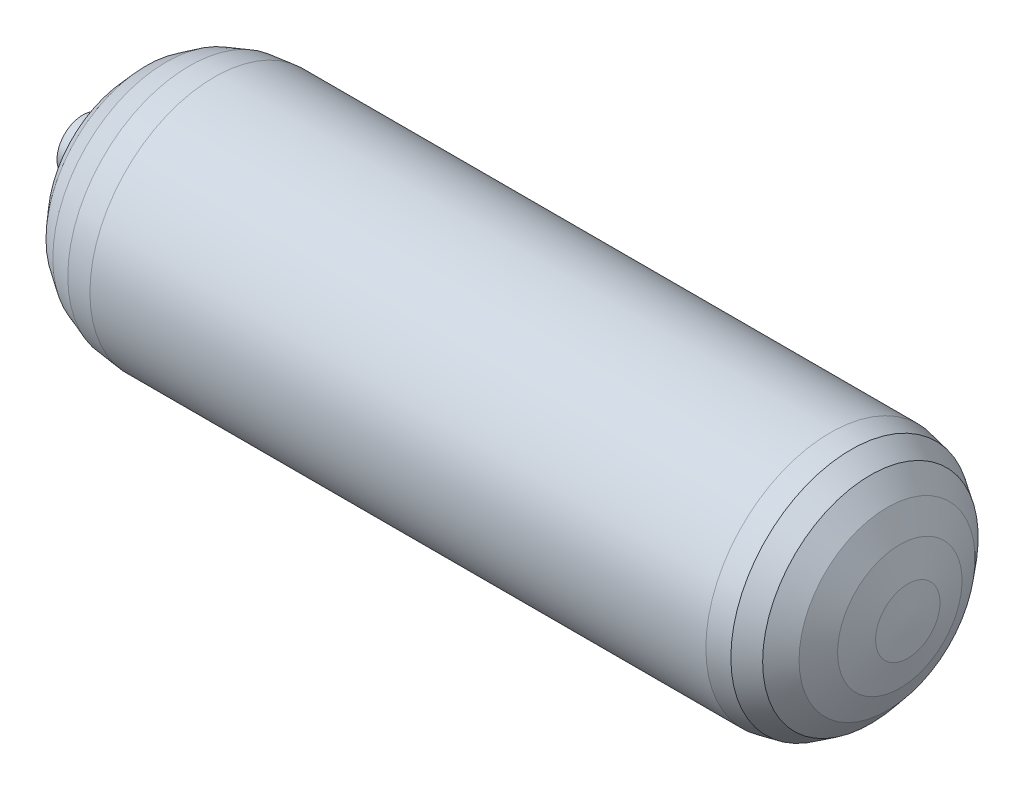
ISO-10303-21;
HEADER;
FILE_DESCRIPTION(('STEP AP214'),'2;1');
FILE_NAME('part.step','',(''),(''),'','','');
FILE_SCHEMA(('AUTOMOTIVE_DESIGN { 1 0 10303 214 1 1 1 1 }'));
ENDSEC;
DATA;
#1=APPLICATION_CONTEXT('core data for automotive mechanical design processes');
#2=APPLICATION_PROTOCOL_DEFINITION('international standard','automotive_design',2000,#1);
#3=PRODUCT_CONTEXT('',#1,'mechanical');
#4=PRODUCT('Part','Part','',(#3));
#5=PRODUCT_RELATED_PRODUCT_CATEGORY('part','',(#4));
#6=PRODUCT_DEFINITION_FORMATION('','',#4);
#7=PRODUCT_DEFINITION_CONTEXT('part definition',#1,'design');
#8=PRODUCT_DEFINITION('design','',#6,#7);
#9=PRODUCT_DEFINITION_SHAPE('','',#8);
#10=(LENGTH_UNIT() NAMED_UNIT(*) SI_UNIT(.MILLI.,.METRE.));
#11=(NAMED_UNIT(*) PLANE_ANGLE_UNIT() SI_UNIT($,.RADIAN.));
#12=(NAMED_UNIT(*) SI_UNIT($,.STERADIAN.) SOLID_ANGLE_UNIT());
#13=UNCERTAINTY_MEASURE_WITH_UNIT(LENGTH_MEASURE(1.E-05),#10,'distance_accuracy_value','');
#14=(GEOMETRIC_REPRESENTATION_CONTEXT(3) GLOBAL_UNCERTAINTY_ASSIGNED_CONTEXT((#13)) GLOBAL_UNIT_ASSIGNED_CONTEXT((#10,
#11,#12)) REPRESENTATION_CONTEXT('',''));
#15=CARTESIAN_POINT('',(0.,0.,0.));
#16=DIRECTION('',(0.,0.,1.));
#17=DIRECTION('',(1.,0.,0.));
#18=AXIS2_PLACEMENT_3D('',#15,#16,#17);
#19=CARTESIAN_POINT('',(0.,0.,0.));
#20=DIRECTION('',(1.,0.,0.));
#21=DIRECTION('',(0.,0.,-1.));
#22=AXIS2_PLACEMENT_3D('',#19,#20,#21);
#23=PLANE('',#22);
#24=CARTESIAN_POINT('',(0.,0.,0.));
#25=DIRECTION('',(1.,0.,0.));
#26=DIRECTION('',(0.,0.,-1.));
#27=AXIS2_PLACEMENT_3D('',#24,#25,#26);
#28=CIRCLE('',#27,10.1125);
#29=CARTESIAN_POINT('',(0.,0.,-10.1125));
#30=VERTEX_POINT('',#29);
#31=EDGE_CURVE('E42',#30,#30,#28,.F.);
#32=ORIENTED_EDGE('',*,*,#31,.F.);
#33=EDGE_LOOP('',(#32));
#34=FACE_BOUND('',#33,.T.);
#35=CARTESIAN_POINT('',(0.,0.,0.));
#36=DIRECTION('',(-1.,0.,0.));
#37=DIRECTION('',(0.,0.,1.));
#38=AXIS2_PLACEMENT_3D('',#35,#36,#37);
#39=CIRCLE('',#38,16.);
#40=CARTESIAN_POINT('',(0.,0.,16.));
#41=VERTEX_POINT('',#40);
#42=EDGE_CURVE('E11',#41,#41,#39,.T.);
#43=ORIENTED_EDGE('',*,*,#42,.T.);
#44=EDGE_LOOP('',(#43));
#45=FACE_BOUND('',#44,.T.);
#46=ADVANCED_FACE('F41',(#34,#45),#23,.F.);
#47=CARTESIAN_POINT('',(-1000.,0.,0.));
#48=DIRECTION('',(-1.,0.,0.));
#49=DIRECTION('',(0.,0.,1.));
#50=AXIS2_PLACEMENT_3D('',#47,#48,#49);
#51=CYLINDRICAL_SURFACE('',#50,16.);
#52=ORIENTED_EDGE('',*,*,#42,.F.);
#53=EDGE_LOOP('',(#52));
#54=FACE_BOUND('',#53,.T.);
#55=CARTESIAN_POINT('',(10.,0.,0.));
#56=DIRECTION('',(-1.,0.,0.));
#57=DIRECTION('',(0.,0.,1.));
#58=AXIS2_PLACEMENT_3D('',#55,#56,#57);
#59=CIRCLE('',#58,16.);
#60=CARTESIAN_POINT('',(10.,0.,16.));
#61=VERTEX_POINT('',#60);
#62=EDGE_CURVE('E48',#61,#61,#59,.T.);
#63=ORIENTED_EDGE('',*,*,#62,.T.);
#64=EDGE_LOOP('',(#63));
#65=FACE_BOUND('',#64,.T.);
#66=ADVANCED_FACE('F68',(#54,#65),#51,.T.);
#67=CARTESIAN_POINT('',(22.,0.,0.));
#68=DIRECTION('',(1.,0.,0.));
#69=DIRECTION('',(0.,0.,-1.));
#70=AXIS2_PLACEMENT_3D('',#67,#68,#69);
#71=CONICAL_SURFACE('',#70,26.,0.694738276196703);
#72=ORIENTED_EDGE('',*,*,#62,.F.);
#73=EDGE_LOOP('',(#72));
#74=FACE_BOUND('',#73,.T.);
#75=CARTESIAN_POINT('',(22.,0.,0.));
#76=DIRECTION('',(-1.,0.,0.));
#77=DIRECTION('',(0.,0.,1.));
#78=AXIS2_PLACEMENT_3D('',#75,#76,#77);
#79=CIRCLE('',#78,26.);
#80=CARTESIAN_POINT('',(22.,0.,26.));
#81=VERTEX_POINT('',#80);
#82=EDGE_CURVE('E83',#81,#81,#79,.T.);
#83=ORIENTED_EDGE('',*,*,#82,.T.);
#84=EDGE_LOOP('',(#83));
#85=FACE_BOUND('',#84,.T.);
#86=ADVANCED_FACE('F73',(#74,#85),#71,.T.);
#87=CARTESIAN_POINT('',(24.0444504226558,0.,0.));
#88=DIRECTION('',(1.,0.,0.));
#89=DIRECTION('',(0.,0.,-1.));
#90=AXIS2_PLACEMENT_3D('',#87,#88,#89);
#91=CONICAL_SURFACE('',#90,39.3291808227798,1.41860089104844);
#92=ORIENTED_EDGE('',*,*,#82,.F.);
#93=EDGE_LOOP('',(#92));
#94=FACE_BOUND('',#93,.T.);
#95=CARTESIAN_POINT('',(24.0444504226558,0.,0.));
#96=DIRECTION('',(-1.,0.,0.));
#97=DIRECTION('',(0.,0.,1.));
#98=AXIS2_PLACEMENT_3D('',#95,#96,#97);
#99=CIRCLE('',#98,39.3291808227798);
#100=CARTESIAN_POINT('',(24.0444504226558,0.,39.3291808227798));
#101=VERTEX_POINT('',#100);
#102=EDGE_CURVE('E86',#101,#101,#99,.T.);
#103=ORIENTED_EDGE('',*,*,#102,.T.);
#104=EDGE_LOOP('',(#103));
#105=FACE_BOUND('',#104,.T.);
#106=ADVANCED_FACE('F246',(#94,#105),#91,.T.);
#107=CARTESIAN_POINT('',(30.0384757729337,0.,0.));
#108=DIRECTION('',(1.,0.,0.));
#109=DIRECTION('',(0.,0.,-1.));
#110=AXIS2_PLACEMENT_3D('',#107,#108,#109);
#111=CONICAL_SURFACE('',#110,51.75,1.12118247006654);
#112=ORIENTED_EDGE('',*,*,#102,.F.);
#113=EDGE_LOOP('',(#112));
#114=FACE_BOUND('',#113,.T.);
#115=CARTESIAN_POINT('',(30.0384757729337,0.,0.));
#116=DIRECTION('',(-1.,0.,0.));
#117=DIRECTION('',(0.,0.,1.));
#118=AXIS2_PLACEMENT_3D('',#115,#116,#117);
#119=CIRCLE('',#118,51.75);
#120=CARTESIAN_POINT('',(30.0384757729337,0.,51.75));
#121=VERTEX_POINT('',#120);
#122=EDGE_CURVE('E91',#121,#121,#119,.T.);
#123=ORIENTED_EDGE('',*,*,#122,.T.);
#124=EDGE_LOOP('',(#123));
#125=FACE_BOUND('',#124,.T.);
#126=ADVANCED_FACE('F239',(#114,#125),#111,.T.);
#127=CARTESIAN_POINT('',(39.5735931288073,0.,0.));
#128=DIRECTION('',(1.,0.,0.));
#129=DIRECTION('',(0.,0.,-1.));
#130=AXIS2_PLACEMENT_3D('',#127,#128,#129);
#131=CONICAL_SURFACE('',#130,62.4159992311072,0.841320950320906);
#132=ORIENTED_EDGE('',*,*,#122,.F.);
#133=EDGE_LOOP('',(#132));
#134=FACE_BOUND('',#133,.T.);
#135=CARTESIAN_POINT('',(39.5735931288073,0.,0.));
#136=DIRECTION('',(-1.,0.,0.));
#137=DIRECTION('',(0.,0.,1.));
#138=AXIS2_PLACEMENT_3D('',#135,#136,#137);
#139=CIRCLE('',#138,62.4159992311072);
#140=CARTESIAN_POINT('',(39.5735931288073,0.,62.4159992311072));
#141=VERTEX_POINT('',#140);
#142=EDGE_CURVE('E96',#141,#141,#139,.T.);
#143=ORIENTED_EDGE('',*,*,#142,.T.);
#144=EDGE_LOOP('',(#143));
#145=FACE_BOUND('',#144,.T.);
#146=ADVANCED_FACE('F228',(#134,#145),#131,.T.);
#147=CARTESIAN_POINT('',(52.,0.,0.));
#148=DIRECTION('',(1.,0.,0.));
#149=DIRECTION('',(0.,0.,-1.));
#150=AXIS2_PLACEMENT_3D('',#147,#148,#149);
#151=CONICAL_SURFACE('',#150,70.6003082948986,0.582412752500819);
#152=ORIENTED_EDGE('',*,*,#142,.F.);
#153=EDGE_LOOP('',(#152));
#154=FACE_BOUND('',#153,.T.);
#155=CARTESIAN_POINT('',(52.,0.,0.));
#156=DIRECTION('',(-1.,0.,0.));
#157=DIRECTION('',(0.,0.,1.));
#158=AXIS2_PLACEMENT_3D('',#155,#156,#157);
#159=CIRCLE('',#158,70.6003082948986);
#160=CARTESIAN_POINT('',(52.,0.,70.6003082948986));
#161=VERTEX_POINT('',#160);
#162=EDGE_CURVE('E97',#161,#161,#159,.T.);
#163=ORIENTED_EDGE('',*,*,#162,.T.);
#164=EDGE_LOOP('',(#163));
#165=FACE_BOUND('',#164,.T.);
#166=ADVANCED_FACE('F218',(#154,#165),#151,.T.);
#167=CARTESIAN_POINT('',(66.4708572938488,0.,0.));
#168=DIRECTION('',(1.,0.,0.));
#169=DIRECTION('',(0.,0.,-1.));
#170=AXIS2_PLACEMENT_3D('',#167,#168,#169);
#171=CONICAL_SURFACE('',#170,75.745180053887,0.341595739566423);
#172=ORIENTED_EDGE('',*,*,#162,.F.);
#173=EDGE_LOOP('',(#172));
#174=FACE_BOUND('',#173,.T.);
#175=CARTESIAN_POINT('',(66.4708572938488,0.,0.));
#176=DIRECTION('',(-1.,0.,0.));
#177=DIRECTION('',(0.,0.,1.));
#178=AXIS2_PLACEMENT_3D('',#175,#176,#177);
#179=CIRCLE('',#178,75.745180053887);
#180=CARTESIAN_POINT('',(66.4708572938488,0.,75.745180053887));
#181=VERTEX_POINT('',#180);
#182=EDGE_CURVE('E105',#181,#181,#179,.T.);
#183=ORIENTED_EDGE('',*,*,#182,.T.);
#184=EDGE_LOOP('',(#183));
#185=FACE_BOUND('',#184,.T.);
#186=ADVANCED_FACE('F207',(#174,#185),#171,.T.);
#187=CARTESIAN_POINT('',(82.0000000000001,0.,0.));
#188=DIRECTION('',(1.,0.,0.));
#189=DIRECTION('',(0.,0.,-1.));
#190=AXIS2_PLACEMENT_3D('',#187,#188,#189);
#191=CONICAL_SURFACE('',#190,77.5,0.112524391245655);
#192=ORIENTED_EDGE('',*,*,#182,.F.);
#193=EDGE_LOOP('',(#192));
#194=FACE_BOUND('',#193,.T.);
#195=CARTESIAN_POINT('',(82.0000000000001,0.,0.));
#196=DIRECTION('',(-1.,0.,0.));
#197=DIRECTION('',(0.,0.,1.));
#198=AXIS2_PLACEMENT_3D('',#195,#196,#197);
#199=CIRCLE('',#198,77.5);
#200=CARTESIAN_POINT('',(82.0000000000001,0.,77.5));
#201=VERTEX_POINT('',#200);
#202=EDGE_CURVE('E104',#201,#201,#199,.T.);
#203=ORIENTED_EDGE('',*,*,#202,.T.);
#204=EDGE_LOOP('',(#203));
#205=FACE_BOUND('',#204,.T.);
#206=ADVANCED_FACE('F200',(#194,#205),#191,.T.);
#207=CARTESIAN_POINT('',(-1000.,0.,0.));
#208=DIRECTION('',(-1.,0.,0.));
#209=DIRECTION('',(0.,0.,1.));
#210=AXIS2_PLACEMENT_3D('',#207,#208,#209);
#211=CYLINDRICAL_SURFACE('',#210,77.5);
#212=ORIENTED_EDGE('',*,*,#202,.F.);
#213=EDGE_LOOP('',(#212));
#214=FACE_BOUND('',#213,.T.);
#215=CARTESIAN_POINT('',(465.6,0.,0.));
#216=DIRECTION('',(-1.,0.,0.));
#217=DIRECTION('',(0.,0.,1.));
#218=AXIS2_PLACEMENT_3D('',#215,#216,#217);
#219=CIRCLE('',#218,77.5);
#220=CARTESIAN_POINT('',(465.6,0.,77.5));
#221=VERTEX_POINT('',#220);
#222=EDGE_CURVE('E107',#221,#221,#219,.T.);
#223=ORIENTED_EDGE('',*,*,#222,.T.);
#224=EDGE_LOOP('',(#223));
#225=FACE_BOUND('',#224,.T.);
#226=ADVANCED_FACE('F188',(#214,#225),#211,.T.);
#227=CARTESIAN_POINT('',(478.540952255126,0.,0.));
#228=DIRECTION('',(-1.,0.,0.));
#229=DIRECTION('',(0.,0.,1.));
#230=AXIS2_PLACEMENT_3D('',#227,#228,#229);
#231=CONICAL_SURFACE('',#230,74.8592515374028,0.201297657036481);
#232=ORIENTED_EDGE('',*,*,#222,.F.);
#233=EDGE_LOOP('',(#232));
#234=FACE_BOUND('',#233,.T.);
#235=CARTESIAN_POINT('',(478.540952255126,0.,0.));
#236=DIRECTION('',(-1.,0.,0.));
#237=DIRECTION('',(0.,0.,1.));
#238=AXIS2_PLACEMENT_3D('',#235,#236,#237);
#239=CIRCLE('',#238,74.8592515374028);
#240=CARTESIAN_POINT('',(478.540952255126,0.,74.8592515374028));
#241=VERTEX_POINT('',#240);
#242=EDGE_CURVE('E112',#241,#241,#239,.T.);
#243=ORIENTED_EDGE('',*,*,#242,.T.);
#244=EDGE_LOOP('',(#243));
#245=FACE_BOUND('',#244,.T.);
#246=ADVANCED_FACE('F176',(#234,#245),#231,.T.);
#247=CARTESIAN_POINT('',(490.6,0.,0.));
#248=DIRECTION('',(-1.,0.,0.));
#249=DIRECTION('',(0.,0.,1.));
#250=AXIS2_PLACEMENT_3D('',#247,#248,#249);
#251=CONICAL_SURFACE('',#250,67.116968793294,0.570752712318134);
#252=ORIENTED_EDGE('',*,*,#242,.F.);
#253=EDGE_LOOP('',(#252));
#254=FACE_BOUND('',#253,.T.);
#255=CARTESIAN_POINT('',(490.6,0.,0.));
#256=DIRECTION('',(-1.,0.,0.));
#257=DIRECTION('',(0.,0.,1.));
#258=AXIS2_PLACEMENT_3D('',#255,#256,#257);
#259=CIRCLE('',#258,67.116968793294);
#260=CARTESIAN_POINT('',(490.6,0.,67.116968793294));
#261=VERTEX_POINT('',#260);
#262=EDGE_CURVE('E111',#261,#261,#259,.T.);
#263=ORIENTED_EDGE('',*,*,#262,.T.);
#264=EDGE_LOOP('',(#263));
#265=FACE_BOUND('',#264,.T.);
#266=ADVANCED_FACE('F166',(#254,#265),#251,.T.);
#267=CARTESIAN_POINT('',(500.955339059328,0.,0.));
#268=DIRECTION('',(-1.,0.,0.));
#269=DIRECTION('',(0.,0.,1.));
#270=AXIS2_PLACEMENT_3D('',#267,#268,#269);
#271=CONICAL_SURFACE('',#270,54.8007755419574,0.871673172229427);
#272=ORIENTED_EDGE('',*,*,#262,.F.);
#273=EDGE_LOOP('',(#272));
#274=FACE_BOUND('',#273,.T.);
#275=CARTESIAN_POINT('',(500.955339059328,0.,0.));
#276=DIRECTION('',(-1.,0.,0.));
#277=DIRECTION('',(0.,0.,1.));
#278=AXIS2_PLACEMENT_3D('',#275,#276,#277);
#279=CIRCLE('',#278,54.8007755419574);
#280=CARTESIAN_POINT('',(500.955339059328,0.,54.8007755419574));
#281=VERTEX_POINT('',#280);
#282=EDGE_CURVE('E120',#281,#281,#279,.T.);
#283=ORIENTED_EDGE('',*,*,#282,.T.);
#284=EDGE_LOOP('',(#283));
#285=FACE_BOUND('',#284,.T.);
#286=ADVANCED_FACE('F157',(#274,#285),#271,.T.);
#287=CARTESIAN_POINT('',(508.901270189222,0.,0.));
#288=DIRECTION('',(-1.,0.,0.));
#289=DIRECTION('',(0.,0.,1.));
#290=AXIS2_PLACEMENT_3D('',#287,#288,#289);
#291=CONICAL_SURFACE('',#290,38.75,1.11111681864113);
#292=ORIENTED_EDGE('',*,*,#282,.F.);
#293=EDGE_LOOP('',(#292));
#294=FACE_BOUND('',#293,.T.);
#295=CARTESIAN_POINT('',(508.901270189222,0.,0.));
#296=DIRECTION('',(-1.,0.,0.));
#297=DIRECTION('',(0.,0.,1.));
#298=AXIS2_PLACEMENT_3D('',#295,#296,#297);
#299=CIRCLE('',#298,38.75);
#300=CARTESIAN_POINT('',(508.901270189222,0.,38.75));
#301=VERTEX_POINT('',#300);
#302=EDGE_CURVE('E119',#301,#301,#299,.T.);
#303=ORIENTED_EDGE('',*,*,#302,.T.);
#304=EDGE_LOOP('',(#303));
#305=FACE_BOUND('',#304,.T.);
#306=ADVANCED_FACE('F64',(#294,#305),#291,.T.);
#307=CARTESIAN_POINT('',(513.896291314453,0.,0.));
#308=DIRECTION('',(-1.,0.,0.));
#309=DIRECTION('',(0.,0.,1.));
#310=AXIS2_PLACEMENT_3D('',#307,#308,#309);
#311=CONICAL_SURFACE('',#310,20.0584759954454,1.30966382256417);
#312=ORIENTED_EDGE('',*,*,#302,.F.);
#313=EDGE_LOOP('',(#312));
#314=FACE_BOUND('',#313,.T.);
#315=CARTESIAN_POINT('',(513.896291314453,0.,0.));
#316=DIRECTION('',(-1.,0.,0.));
#317=DIRECTION('',(0.,0.,1.));
#318=AXIS2_PLACEMENT_3D('',#315,#316,#317);
#319=CIRCLE('',#318,20.0584759954454);
#320=CARTESIAN_POINT('',(513.896291314453,0.,20.0584759954454));
#321=VERTEX_POINT('',#320);
#322=EDGE_CURVE('E125',#321,#321,#319,.T.);
#323=ORIENTED_EDGE('',*,*,#322,.T.);
#324=EDGE_LOOP('',(#323));
#325=FACE_BOUND('',#324,.T.);
#326=ADVANCED_FACE('F53',(#314,#325),#311,.T.);
#327=CARTESIAN_POINT('',(515.6,0.,0.));
#328=DIRECTION('',(-1.,0.,0.));
#329=DIRECTION('',(0.,0.,1.));
#330=AXIS2_PLACEMENT_3D('',#327,#328,#329);
#331=CONICAL_SURFACE('',#330,0.,1.48606260615853);
#332=ORIENTED_EDGE('',*,*,#322,.F.);
#333=EDGE_LOOP('',(#332));
#334=FACE_BOUND('',#333,.T.);
#335=CARTESIAN_POINT('',(515.6,0.,0.));
#336=VERTEX_POINT('',#335);
#337=VERTEX_LOOP('',#336);
#338=FACE_BOUND('',#337,.T.);
#339=ADVANCED_FACE('F51',(#334,#338),#331,.T.);
#340=CARTESIAN_POINT('',(-1000.,0.,0.));
#341=DIRECTION('',(-1.,0.,0.));
#342=DIRECTION('',(0.,0.,1.));
#343=AXIS2_PLACEMENT_3D('',#340,#341,#342);
#344=CYLINDRICAL_SURFACE('',#343,10.1125);
#345=CARTESIAN_POINT('',(14.9999999999999,0.,0.));
#346=DIRECTION('',(-1.,0.,0.));
#347=DIRECTION('',(0.,0.,1.));
#348=AXIS2_PLACEMENT_3D('',#345,#346,#347);
#349=CIRCLE('',#348,10.1125);
#350=CARTESIAN_POINT('',(14.9999999999999,0.,10.1125));
#351=VERTEX_POINT('',#350);
#352=EDGE_CURVE('E127',#351,#351,#349,.T.);
#353=ORIENTED_EDGE('',*,*,#352,.F.);
#354=EDGE_LOOP('',(#353));
#355=FACE_BOUND('',#354,.T.);
#356=ORIENTED_EDGE('',*,*,#31,.T.);
#357=EDGE_LOOP('',(#356));
#358=FACE_BOUND('',#357,.T.);
#359=ADVANCED_FACE('F52',(#355,#358),#344,.F.);
#360=CARTESIAN_POINT('',(15.,0.,0.));
#361=DIRECTION('',(-1.,0.,0.));
#362=DIRECTION('',(0.,0.,1.));
#363=AXIS2_PLACEMENT_3D('',#360,#361,#362);
#364=PLANE('',#363);
#365=ORIENTED_EDGE('',*,*,#352,.T.);
#366=EDGE_LOOP('',(#365));
#367=FACE_BOUND('',#366,.T.);
#368=ADVANCED_FACE('F65',(#367),#364,.T.);
#369=CLOSED_SHELL('',(#46,#66,#86,#106,#126,#146,#166,#186,#206,#226,#246,#266,#286,#306,#326,
#339,#359,#368));
#370=MANIFOLD_SOLID_BREP('B2',#369);
#371=ADVANCED_BREP_SHAPE_REPRESENTATION('',(#18,#370),#14);
#372=SHAPE_DEFINITION_REPRESENTATION(#9,#371);
ENDSEC;
END-ISO-10303-21;
